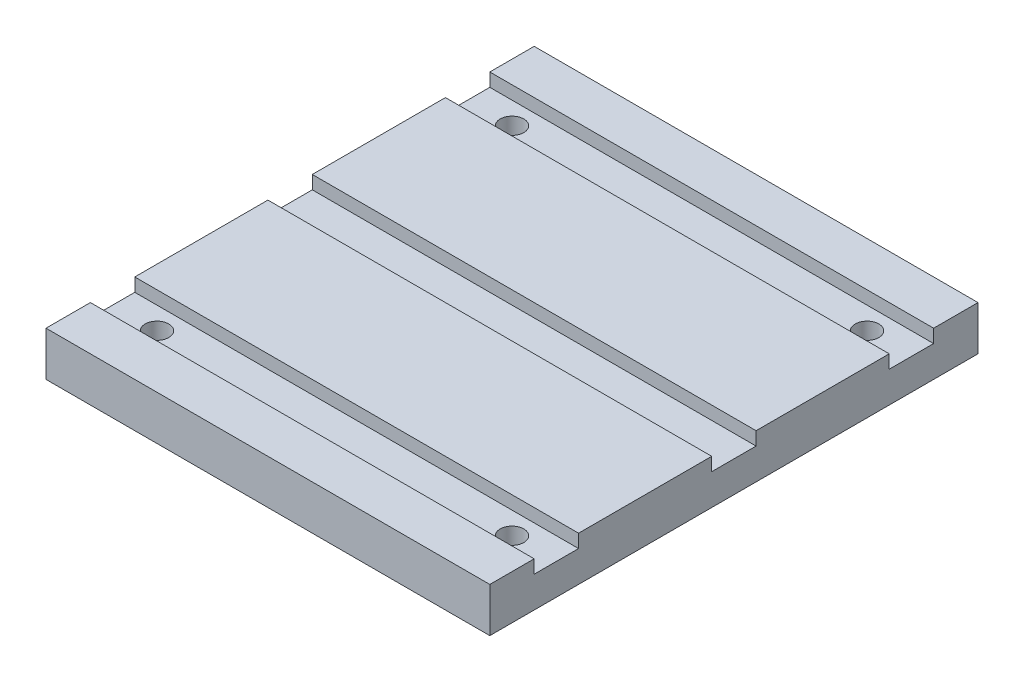
ISO-10303-21;
HEADER;
FILE_DESCRIPTION(('STEP AP214'),'2;1');
FILE_NAME('part.step','',(''),(''),'','','');
FILE_SCHEMA(('AUTOMOTIVE_DESIGN { 1 0 10303 214 1 1 1 1 }'));
ENDSEC;
DATA;
#1=APPLICATION_CONTEXT('core data for automotive mechanical design processes');
#2=APPLICATION_PROTOCOL_DEFINITION('international standard','automotive_design',2000,#1);
#3=PRODUCT_CONTEXT('',#1,'mechanical');
#4=PRODUCT('Part','Part','',(#3));
#5=PRODUCT_RELATED_PRODUCT_CATEGORY('part','',(#4));
#6=PRODUCT_DEFINITION_FORMATION('','',#4);
#7=PRODUCT_DEFINITION_CONTEXT('part definition',#1,'design');
#8=PRODUCT_DEFINITION('design','',#6,#7);
#9=PRODUCT_DEFINITION_SHAPE('','',#8);
#10=(LENGTH_UNIT() NAMED_UNIT(*) SI_UNIT(.MILLI.,.METRE.));
#11=(NAMED_UNIT(*) PLANE_ANGLE_UNIT() SI_UNIT($,.RADIAN.));
#12=(NAMED_UNIT(*) SI_UNIT($,.STERADIAN.) SOLID_ANGLE_UNIT());
#13=UNCERTAINTY_MEASURE_WITH_UNIT(LENGTH_MEASURE(1.E-05),#10,'distance_accuracy_value','');
#14=(GEOMETRIC_REPRESENTATION_CONTEXT(3) GLOBAL_UNCERTAINTY_ASSIGNED_CONTEXT((#13)) GLOBAL_UNIT_ASSIGNED_CONTEXT((#10,
#11,#12)) REPRESENTATION_CONTEXT('',''));
#15=CARTESIAN_POINT('',(0.,0.,0.));
#16=DIRECTION('',(0.,0.,1.));
#17=DIRECTION('',(1.,0.,0.));
#18=AXIS2_PLACEMENT_3D('',#15,#16,#17);
#19=CARTESIAN_POINT('',(0.,12.7,0.));
#20=DIRECTION('',(0.,1.,0.));
#21=DIRECTION('',(0.,0.,1.));
#22=AXIS2_PLACEMENT_3D('',#19,#20,#21);
#23=PLANE('',#22);
#24=DIRECTION('',(1.,0.,0.));
#25=VECTOR('',#24,1.);
#26=CARTESIAN_POINT('',(-12.7,12.7,6.35));
#27=LINE('',#26,#25);
#28=CARTESIAN_POINT('',(-63.5,12.7,6.34999999999999));
#29=VERTEX_POINT('',#28);
#30=CARTESIAN_POINT('',(63.5,12.7,6.34999999999999));
#31=VERTEX_POINT('',#30);
#32=EDGE_CURVE('E156',#29,#31,#27,.T.);
#33=ORIENTED_EDGE('',*,*,#32,.F.);
#34=DIRECTION('',(0.,0.,1.));
#35=VECTOR('',#34,1.);
#36=CARTESIAN_POINT('',(-63.5,12.7,-69.85));
#37=LINE('',#36,#35);
#38=CARTESIAN_POINT('',(-63.5,12.7,44.45));
#39=VERTEX_POINT('',#38);
#40=EDGE_CURVE('E159',#29,#39,#37,.T.);
#41=ORIENTED_EDGE('',*,*,#40,.T.);
#42=DIRECTION('',(1.,0.,0.));
#43=VECTOR('',#42,1.);
#44=CARTESIAN_POINT('',(-12.7,12.7,44.45));
#45=LINE('',#44,#43);
#46=CARTESIAN_POINT('',(63.5,12.7,44.45));
#47=VERTEX_POINT('',#46);
#48=EDGE_CURVE('E225',#39,#47,#45,.T.);
#49=ORIENTED_EDGE('',*,*,#48,.T.);
#50=DIRECTION('',(0.,0.,-1.));
#51=VECTOR('',#50,1.);
#52=CARTESIAN_POINT('',(63.5,12.7,-69.85));
#53=LINE('',#52,#51);
#54=EDGE_CURVE('E162',#47,#31,#53,.T.);
#55=ORIENTED_EDGE('',*,*,#54,.T.);
#56=EDGE_LOOP('',(#33,#41,#49,#55));
#57=FACE_BOUND('',#56,.T.);
#58=ADVANCED_FACE('F33',(#57),#23,.T.);
#59=CARTESIAN_POINT('',(-63.5,12.7,-44.45));
#60=VERTEX_POINT('',#59);
#61=CARTESIAN_POINT('',(-63.5,12.7,-6.35));
#62=VERTEX_POINT('',#61);
#63=EDGE_CURVE('E183',#60,#62,#37,.T.);
#64=ORIENTED_EDGE('',*,*,#63,.T.);
#65=DIRECTION('',(1.,0.,0.));
#66=VECTOR('',#65,1.);
#67=CARTESIAN_POINT('',(-12.7,12.7,-6.34999999999999));
#68=LINE('',#67,#66);
#69=CARTESIAN_POINT('',(63.5,12.7,-6.35));
#70=VERTEX_POINT('',#69);
#71=EDGE_CURVE('E167',#62,#70,#68,.T.);
#72=ORIENTED_EDGE('',*,*,#71,.T.);
#73=CARTESIAN_POINT('',(63.5,12.7,-44.45));
#74=VERTEX_POINT('',#73);
#75=EDGE_CURVE('E280',#70,#74,#53,.T.);
#76=ORIENTED_EDGE('',*,*,#75,.T.);
#77=DIRECTION('',(1.,0.,0.));
#78=VECTOR('',#77,1.);
#79=CARTESIAN_POINT('',(-12.7,12.7,-44.45));
#80=LINE('',#79,#78);
#81=EDGE_CURVE('E266',#60,#74,#80,.T.);
#82=ORIENTED_EDGE('',*,*,#81,.F.);
#83=EDGE_LOOP('',(#64,#72,#76,#82));
#84=FACE_BOUND('',#83,.T.);
#85=ADVANCED_FACE('F291',(#84),#23,.T.);
#86=CARTESIAN_POINT('',(-63.5,12.7,-69.85));
#87=DIRECTION('',(1.,0.,0.));
#88=DIRECTION('',(0.,0.,-1.));
#89=AXIS2_PLACEMENT_3D('',#86,#87,#88);
#90=PLANE('',#89);
#91=DIRECTION('',(0.,-1.,0.));
#92=VECTOR('',#91,1.);
#93=CARTESIAN_POINT('',(-63.5,12.7,6.34999999999999));
#94=LINE('',#93,#92);
#95=CARTESIAN_POINT('',(-63.5,8.89,6.35));
#96=VERTEX_POINT('',#95);
#97=EDGE_CURVE('E170',#29,#96,#94,.T.);
#98=ORIENTED_EDGE('',*,*,#97,.T.);
#99=DIRECTION('',(0.,0.,-1.));
#100=VECTOR('',#99,1.);
#101=CARTESIAN_POINT('',(-63.5,8.89,6.35));
#102=LINE('',#101,#100);
#103=CARTESIAN_POINT('',(-63.5,8.89,-6.35));
#104=VERTEX_POINT('',#103);
#105=EDGE_CURVE('E340',#96,#104,#102,.T.);
#106=ORIENTED_EDGE('',*,*,#105,.T.);
#107=DIRECTION('',(0.,1.,0.));
#108=VECTOR('',#107,1.);
#109=CARTESIAN_POINT('',(-63.5,12.7,-6.35));
#110=LINE('',#109,#108);
#111=EDGE_CURVE('E175',#104,#62,#110,.T.);
#112=ORIENTED_EDGE('',*,*,#111,.T.);
#113=ORIENTED_EDGE('',*,*,#63,.F.);
#114=DIRECTION('',(0.,1.,0.));
#115=VECTOR('',#114,1.);
#116=CARTESIAN_POINT('',(-63.5,12.7,-44.45));
#117=LINE('',#116,#115);
#118=CARTESIAN_POINT('',(-63.5,8.89,-44.45));
#119=VERTEX_POINT('',#118);
#120=EDGE_CURVE('E230',#119,#60,#117,.T.);
#121=ORIENTED_EDGE('',*,*,#120,.F.);
#122=DIRECTION('',(0.,0.,1.));
#123=VECTOR('',#122,1.);
#124=CARTESIAN_POINT('',(-63.5,8.89,-57.15));
#125=LINE('',#124,#123);
#126=CARTESIAN_POINT('',(-63.5,8.89,-57.15));
#127=VERTEX_POINT('',#126);
#128=EDGE_CURVE('E235',#127,#119,#125,.T.);
#129=ORIENTED_EDGE('',*,*,#128,.F.);
#130=DIRECTION('',(0.,-1.,0.));
#131=VECTOR('',#130,1.);
#132=CARTESIAN_POINT('',(-63.5,12.7,-57.15));
#133=LINE('',#132,#131);
#134=CARTESIAN_POINT('',(-63.5,12.7,-57.15));
#135=VERTEX_POINT('',#134);
#136=EDGE_CURVE('E342',#135,#127,#133,.T.);
#137=ORIENTED_EDGE('',*,*,#136,.F.);
#138=CARTESIAN_POINT('',(-63.5,12.7,-69.85));
#139=VERTEX_POINT('',#138);
#140=EDGE_CURVE('E186',#139,#135,#37,.T.);
#141=ORIENTED_EDGE('',*,*,#140,.F.);
#142=DIRECTION('',(0.,-1.,0.));
#143=VECTOR('',#142,1.);
#144=CARTESIAN_POINT('',(-63.5,12.7,-69.85));
#145=LINE('',#144,#143);
#146=CARTESIAN_POINT('',(-63.5,0.,-69.85));
#147=VERTEX_POINT('',#146);
#148=EDGE_CURVE('E42',#139,#147,#145,.T.);
#149=ORIENTED_EDGE('',*,*,#148,.T.);
#150=DIRECTION('',(0.,0.,1.));
#151=VECTOR('',#150,1.);
#152=CARTESIAN_POINT('',(-63.5,0.,-69.85));
#153=LINE('',#152,#151);
#154=CARTESIAN_POINT('',(-63.5,0.,69.85));
#155=VERTEX_POINT('',#154);
#156=EDGE_CURVE('E68',#147,#155,#153,.T.);
#157=ORIENTED_EDGE('',*,*,#156,.T.);
#158=DIRECTION('',(0.,-1.,0.));
#159=VECTOR('',#158,1.);
#160=CARTESIAN_POINT('',(-63.5,12.7,69.85));
#161=LINE('',#160,#159);
#162=CARTESIAN_POINT('',(-63.5,12.7,69.85));
#163=VERTEX_POINT('',#162);
#164=EDGE_CURVE('E194',#163,#155,#161,.T.);
#165=ORIENTED_EDGE('',*,*,#164,.F.);
#166=CARTESIAN_POINT('',(-63.5,12.7,57.15));
#167=VERTEX_POINT('',#166);
#168=EDGE_CURVE('E184',#167,#163,#37,.T.);
#169=ORIENTED_EDGE('',*,*,#168,.F.);
#170=DIRECTION('',(0.,-1.,0.));
#171=VECTOR('',#170,1.);
#172=CARTESIAN_POINT('',(-63.5,12.7,57.15));
#173=LINE('',#172,#171);
#174=CARTESIAN_POINT('',(-63.5,8.89,57.15));
#175=VERTEX_POINT('',#174);
#176=EDGE_CURVE('E221',#167,#175,#173,.T.);
#177=ORIENTED_EDGE('',*,*,#176,.T.);
#178=DIRECTION('',(0.,0.,-1.));
#179=VECTOR('',#178,1.);
#180=CARTESIAN_POINT('',(-63.5,8.89,57.15));
#181=LINE('',#180,#179);
#182=CARTESIAN_POINT('',(-63.5,8.89,44.45));
#183=VERTEX_POINT('',#182);
#184=EDGE_CURVE('E232',#175,#183,#181,.T.);
#185=ORIENTED_EDGE('',*,*,#184,.T.);
#186=DIRECTION('',(0.,1.,0.));
#187=VECTOR('',#186,1.);
#188=CARTESIAN_POINT('',(-63.5,12.7,44.45));
#189=LINE('',#188,#187);
#190=EDGE_CURVE('E182',#183,#39,#189,.T.);
#191=ORIENTED_EDGE('',*,*,#190,.T.);
#192=ORIENTED_EDGE('',*,*,#40,.F.);
#193=EDGE_LOOP('',(#98,#106,#112,#113,#121,#129,#137,#141,#149,#157,#165,#169,#177,#185,#191,#192));
#194=FACE_BOUND('',#193,.T.);
#195=ADVANCED_FACE('F179',(#194),#90,.F.);
#196=ORIENTED_EDGE('',*,*,#140,.T.);
#197=DIRECTION('',(1.,0.,0.));
#198=VECTOR('',#197,1.);
#199=CARTESIAN_POINT('',(-12.7,12.7,-57.15));
#200=LINE('',#199,#198);
#201=CARTESIAN_POINT('',(63.5,12.7,-57.15));
#202=VERTEX_POINT('',#201);
#203=EDGE_CURVE('E260',#135,#202,#200,.T.);
#204=ORIENTED_EDGE('',*,*,#203,.T.);
#205=CARTESIAN_POINT('',(63.5,12.7,-69.85));
#206=VERTEX_POINT('',#205);
#207=EDGE_CURVE('E82',#202,#206,#53,.T.);
#208=ORIENTED_EDGE('',*,*,#207,.T.);
#209=DIRECTION('',(-1.,0.,0.));
#210=VECTOR('',#209,1.);
#211=CARTESIAN_POINT('',(-63.5,12.7,-69.85));
#212=LINE('',#211,#210);
#213=EDGE_CURVE('E188',#206,#139,#212,.T.);
#214=ORIENTED_EDGE('',*,*,#213,.T.);
#215=EDGE_LOOP('',(#196,#204,#208,#214));
#216=FACE_BOUND('',#215,.T.);
#217=ADVANCED_FACE('F281',(#216),#23,.T.);
#218=DIRECTION('',(1.,0.,0.));
#219=VECTOR('',#218,1.);
#220=CARTESIAN_POINT('',(-12.7,12.7,57.15));
#221=LINE('',#220,#219);
#222=CARTESIAN_POINT('',(63.5,12.7,57.15));
#223=VERTEX_POINT('',#222);
#224=EDGE_CURVE('E201',#167,#223,#221,.T.);
#225=ORIENTED_EDGE('',*,*,#224,.F.);
#226=ORIENTED_EDGE('',*,*,#168,.T.);
#227=DIRECTION('',(1.,0.,0.));
#228=VECTOR('',#227,1.);
#229=CARTESIAN_POINT('',(-63.5,12.7,69.85));
#230=LINE('',#229,#228);
#231=CARTESIAN_POINT('',(63.5,12.7,69.85));
#232=VERTEX_POINT('',#231);
#233=EDGE_CURVE('E50',#163,#232,#230,.T.);
#234=ORIENTED_EDGE('',*,*,#233,.T.);
#235=EDGE_CURVE('E216',#232,#223,#53,.T.);
#236=ORIENTED_EDGE('',*,*,#235,.T.);
#237=EDGE_LOOP('',(#225,#226,#234,#236));
#238=FACE_BOUND('',#237,.T.);
#239=ADVANCED_FACE('F222',(#238),#23,.T.);
#240=CARTESIAN_POINT('',(63.5,12.7,-69.85));
#241=DIRECTION('',(-1.,0.,0.));
#242=DIRECTION('',(0.,0.,1.));
#243=AXIS2_PLACEMENT_3D('',#240,#241,#242);
#244=PLANE('',#243);
#245=DIRECTION('',(0.,0.,-1.));
#246=VECTOR('',#245,1.);
#247=CARTESIAN_POINT('',(63.5,8.89,6.35));
#248=LINE('',#247,#246);
#249=CARTESIAN_POINT('',(63.5,8.89,6.35));
#250=VERTEX_POINT('',#249);
#251=CARTESIAN_POINT('',(63.5,8.89,-6.35));
#252=VERTEX_POINT('',#251);
#253=EDGE_CURVE('E242',#250,#252,#248,.T.);
#254=ORIENTED_EDGE('',*,*,#253,.F.);
#255=DIRECTION('',(0.,-1.,0.));
#256=VECTOR('',#255,1.);
#257=CARTESIAN_POINT('',(63.5,12.7,6.34999999999999));
#258=LINE('',#257,#256);
#259=EDGE_CURVE('E240',#31,#250,#258,.T.);
#260=ORIENTED_EDGE('',*,*,#259,.F.);
#261=ORIENTED_EDGE('',*,*,#54,.F.);
#262=DIRECTION('',(0.,1.,0.));
#263=VECTOR('',#262,1.);
#264=CARTESIAN_POINT('',(63.5,12.7,44.45));
#265=LINE('',#264,#263);
#266=CARTESIAN_POINT('',(63.5,8.89,44.45));
#267=VERTEX_POINT('',#266);
#268=EDGE_CURVE('E273',#267,#47,#265,.T.);
#269=ORIENTED_EDGE('',*,*,#268,.F.);
#270=DIRECTION('',(0.,0.,-1.));
#271=VECTOR('',#270,1.);
#272=CARTESIAN_POINT('',(63.5,8.89,57.15));
#273=LINE('',#272,#271);
#274=CARTESIAN_POINT('',(63.5,8.89,57.15));
#275=VERTEX_POINT('',#274);
#276=EDGE_CURVE('E270',#275,#267,#273,.T.);
#277=ORIENTED_EDGE('',*,*,#276,.F.);
#278=DIRECTION('',(0.,-1.,0.));
#279=VECTOR('',#278,1.);
#280=CARTESIAN_POINT('',(63.5,12.7,57.15));
#281=LINE('',#280,#279);
#282=EDGE_CURVE('E263',#223,#275,#281,.T.);
#283=ORIENTED_EDGE('',*,*,#282,.F.);
#284=ORIENTED_EDGE('',*,*,#235,.F.);
#285=DIRECTION('',(0.,-1.,0.));
#286=VECTOR('',#285,1.);
#287=CARTESIAN_POINT('',(63.5,12.7,69.85));
#288=LINE('',#287,#286);
#289=CARTESIAN_POINT('',(63.5,0.,69.85));
#290=VERTEX_POINT('',#289);
#291=EDGE_CURVE('E193',#232,#290,#288,.T.);
#292=ORIENTED_EDGE('',*,*,#291,.T.);
#293=DIRECTION('',(0.,0.,-1.));
#294=VECTOR('',#293,1.);
#295=CARTESIAN_POINT('',(63.5,0.,-69.85));
#296=LINE('',#295,#294);
#297=CARTESIAN_POINT('',(63.5,0.,-69.85));
#298=VERTEX_POINT('',#297);
#299=EDGE_CURVE('E197',#290,#298,#296,.T.);
#300=ORIENTED_EDGE('',*,*,#299,.T.);
#301=DIRECTION('',(0.,-1.,0.));
#302=VECTOR('',#301,1.);
#303=CARTESIAN_POINT('',(63.5,12.7,-69.85));
#304=LINE('',#303,#302);
#305=EDGE_CURVE('E11',#206,#298,#304,.T.);
#306=ORIENTED_EDGE('',*,*,#305,.F.);
#307=ORIENTED_EDGE('',*,*,#207,.F.);
#308=DIRECTION('',(0.,-1.,0.));
#309=VECTOR('',#308,1.);
#310=CARTESIAN_POINT('',(63.5,12.7,-57.15));
#311=LINE('',#310,#309);
#312=CARTESIAN_POINT('',(63.5,8.89,-57.15));
#313=VERTEX_POINT('',#312);
#314=EDGE_CURVE('E166',#202,#313,#311,.T.);
#315=ORIENTED_EDGE('',*,*,#314,.T.);
#316=DIRECTION('',(0.,0.,1.));
#317=VECTOR('',#316,1.);
#318=CARTESIAN_POINT('',(63.5,8.89,-57.15));
#319=LINE('',#318,#317);
#320=CARTESIAN_POINT('',(63.5,8.89,-44.45));
#321=VERTEX_POINT('',#320);
#322=EDGE_CURVE('E257',#313,#321,#319,.T.);
#323=ORIENTED_EDGE('',*,*,#322,.T.);
#324=DIRECTION('',(0.,1.,0.));
#325=VECTOR('',#324,1.);
#326=CARTESIAN_POINT('',(63.5,12.7,-44.45));
#327=LINE('',#326,#325);
#328=EDGE_CURVE('E254',#321,#74,#327,.T.);
#329=ORIENTED_EDGE('',*,*,#328,.T.);
#330=ORIENTED_EDGE('',*,*,#75,.F.);
#331=DIRECTION('',(0.,1.,0.));
#332=VECTOR('',#331,1.);
#333=CARTESIAN_POINT('',(63.5,12.7,-6.35));
#334=LINE('',#333,#332);
#335=EDGE_CURVE('E245',#252,#70,#334,.T.);
#336=ORIENTED_EDGE('',*,*,#335,.F.);
#337=EDGE_LOOP('',(#254,#260,#261,#269,#277,#283,#284,#292,#300,#306,#307,#315,#323,#329,#330,#336));
#338=FACE_BOUND('',#337,.T.);
#339=ADVANCED_FACE('F35',(#338),#244,.F.);
#340=CARTESIAN_POINT('',(-63.5,12.7,-69.85));
#341=DIRECTION('',(0.,0.,1.));
#342=DIRECTION('',(1.,0.,0.));
#343=AXIS2_PLACEMENT_3D('',#340,#341,#342);
#344=PLANE('',#343);
#345=DIRECTION('',(-1.,0.,0.));
#346=VECTOR('',#345,1.);
#347=CARTESIAN_POINT('',(-63.5,0.,-69.85));
#348=LINE('',#347,#346);
#349=EDGE_CURVE('E200',#298,#147,#348,.T.);
#350=ORIENTED_EDGE('',*,*,#349,.T.);
#351=ORIENTED_EDGE('',*,*,#148,.F.);
#352=ORIENTED_EDGE('',*,*,#213,.F.);
#353=ORIENTED_EDGE('',*,*,#305,.T.);
#354=EDGE_LOOP('',(#350,#351,#352,#353));
#355=FACE_BOUND('',#354,.T.);
#356=ADVANCED_FACE('F282',(#355),#344,.F.);
#357=CARTESIAN_POINT('',(-63.5,12.7,69.85));
#358=DIRECTION('',(0.,0.,-1.));
#359=DIRECTION('',(-1.,0.,0.));
#360=AXIS2_PLACEMENT_3D('',#357,#358,#359);
#361=PLANE('',#360);
#362=DIRECTION('',(1.,0.,0.));
#363=VECTOR('',#362,1.);
#364=CARTESIAN_POINT('',(-63.5,0.,69.85));
#365=LINE('',#364,#363);
#366=EDGE_CURVE('E74',#155,#290,#365,.T.);
#367=ORIENTED_EDGE('',*,*,#366,.T.);
#368=ORIENTED_EDGE('',*,*,#291,.F.);
#369=ORIENTED_EDGE('',*,*,#233,.F.);
#370=ORIENTED_EDGE('',*,*,#164,.T.);
#371=EDGE_LOOP('',(#367,#368,#369,#370));
#372=FACE_BOUND('',#371,.T.);
#373=ADVANCED_FACE('F217',(#372),#361,.F.);
#374=CARTESIAN_POINT('',(0.,0.,0.));
#375=DIRECTION('',(0.,1.,0.));
#376=DIRECTION('',(0.,0.,1.));
#377=AXIS2_PLACEMENT_3D('',#374,#375,#376);
#378=PLANE('',#377);
#379=CARTESIAN_POINT('',(50.8,0.,50.8));
#380=DIRECTION('',(0.,-1.,0.));
#381=DIRECTION('',(0.,0.,-1.));
#382=AXIS2_PLACEMENT_3D('',#379,#380,#381);
#383=CIRCLE('',#382,3.37819999999998);
#384=CARTESIAN_POINT('',(50.8,0.,47.4218));
#385=VERTEX_POINT('',#384);
#386=EDGE_CURVE('E317',#385,#385,#383,.T.);
#387=ORIENTED_EDGE('',*,*,#386,.F.);
#388=EDGE_LOOP('',(#387));
#389=FACE_BOUND('',#388,.T.);
#390=CARTESIAN_POINT('',(50.8,0.,-50.8));
#391=DIRECTION('',(0.,-1.,0.));
#392=DIRECTION('',(0.,0.,-1.));
#393=AXIS2_PLACEMENT_3D('',#390,#391,#392);
#394=CIRCLE('',#393,3.37819999999998);
#395=CARTESIAN_POINT('',(50.8,0.,-54.1782));
#396=VERTEX_POINT('',#395);
#397=EDGE_CURVE('E321',#396,#396,#394,.T.);
#398=ORIENTED_EDGE('',*,*,#397,.F.);
#399=EDGE_LOOP('',(#398));
#400=FACE_BOUND('',#399,.T.);
#401=CARTESIAN_POINT('',(-50.8,0.,-50.8));
#402=DIRECTION('',(0.,-1.,0.));
#403=DIRECTION('',(0.,0.,-1.));
#404=AXIS2_PLACEMENT_3D('',#401,#402,#403);
#405=CIRCLE('',#404,3.37819999999998);
#406=CARTESIAN_POINT('',(-50.8,0.,-54.1782));
#407=VERTEX_POINT('',#406);
#408=EDGE_CURVE('E325',#407,#407,#405,.T.);
#409=ORIENTED_EDGE('',*,*,#408,.F.);
#410=EDGE_LOOP('',(#409));
#411=FACE_BOUND('',#410,.T.);
#412=CARTESIAN_POINT('',(-50.8,0.,50.8));
#413=DIRECTION('',(0.,-1.,0.));
#414=DIRECTION('',(0.,0.,-1.));
#415=AXIS2_PLACEMENT_3D('',#412,#413,#414);
#416=CIRCLE('',#415,3.37819999999998);
#417=CARTESIAN_POINT('',(-50.8,0.,47.4218));
#418=VERTEX_POINT('',#417);
#419=EDGE_CURVE('E328',#418,#418,#416,.T.);
#420=ORIENTED_EDGE('',*,*,#419,.F.);
#421=EDGE_LOOP('',(#420));
#422=FACE_BOUND('',#421,.T.);
#423=ORIENTED_EDGE('',*,*,#299,.F.);
#424=ORIENTED_EDGE('',*,*,#366,.F.);
#425=ORIENTED_EDGE('',*,*,#156,.F.);
#426=ORIENTED_EDGE('',*,*,#349,.F.);
#427=EDGE_LOOP('',(#423,#424,#425,#426));
#428=FACE_BOUND('',#427,.T.);
#429=ADVANCED_FACE('F210',(#389,#400,#411,#422,#428),#378,.F.);
#430=CARTESIAN_POINT('',(-12.7,12.7,57.15));
#431=DIRECTION('',(0.,0.,1.));
#432=DIRECTION('',(1.,0.,0.));
#433=AXIS2_PLACEMENT_3D('',#430,#431,#432);
#434=PLANE('',#433);
#435=ORIENTED_EDGE('',*,*,#224,.T.);
#436=ORIENTED_EDGE('',*,*,#282,.T.);
#437=DIRECTION('',(1.,0.,0.));
#438=VECTOR('',#437,1.);
#439=CARTESIAN_POINT('',(-12.7,8.89,57.15));
#440=LINE('',#439,#438);
#441=EDGE_CURVE('E228',#175,#275,#440,.T.);
#442=ORIENTED_EDGE('',*,*,#441,.F.);
#443=ORIENTED_EDGE('',*,*,#176,.F.);
#444=EDGE_LOOP('',(#435,#436,#442,#443));
#445=FACE_BOUND('',#444,.T.);
#446=ADVANCED_FACE('F227',(#445),#434,.F.);
#447=CARTESIAN_POINT('',(-12.7,12.7,44.45));
#448=DIRECTION('',(0.,0.,-1.));
#449=DIRECTION('',(-1.,0.,0.));
#450=AXIS2_PLACEMENT_3D('',#447,#448,#449);
#451=PLANE('',#450);
#452=DIRECTION('',(1.,0.,0.));
#453=VECTOR('',#452,1.);
#454=CARTESIAN_POINT('',(-12.7,8.89,44.45));
#455=LINE('',#454,#453);
#456=EDGE_CURVE('E277',#183,#267,#455,.T.);
#457=ORIENTED_EDGE('',*,*,#456,.T.);
#458=ORIENTED_EDGE('',*,*,#268,.T.);
#459=ORIENTED_EDGE('',*,*,#48,.F.);
#460=ORIENTED_EDGE('',*,*,#190,.F.);
#461=EDGE_LOOP('',(#457,#458,#459,#460));
#462=FACE_BOUND('',#461,.T.);
#463=ADVANCED_FACE('F313',(#462),#451,.F.);
#464=CARTESIAN_POINT('',(-12.7,8.89,57.15));
#465=DIRECTION('',(0.,-1.,0.));
#466=DIRECTION('',(0.,0.,-1.));
#467=AXIS2_PLACEMENT_3D('',#464,#465,#466);
#468=PLANE('',#467);
#469=CARTESIAN_POINT('',(50.8,8.89,50.8));
#470=DIRECTION('',(0.,-1.,0.));
#471=DIRECTION('',(0.,0.,-1.));
#472=AXIS2_PLACEMENT_3D('',#469,#470,#471);
#473=CIRCLE('',#472,3.37819999999999);
#474=CARTESIAN_POINT('',(50.8,8.89,47.4218));
#475=VERTEX_POINT('',#474);
#476=EDGE_CURVE('E454',#475,#475,#473,.T.);
#477=ORIENTED_EDGE('',*,*,#476,.T.);
#478=EDGE_LOOP('',(#477));
#479=FACE_BOUND('',#478,.T.);
#480=CARTESIAN_POINT('',(-50.8,8.89,50.8));
#481=DIRECTION('',(0.,-1.,0.));
#482=DIRECTION('',(0.,0.,-1.));
#483=AXIS2_PLACEMENT_3D('',#480,#481,#482);
#484=CIRCLE('',#483,3.37819999999999);
#485=CARTESIAN_POINT('',(-50.8,8.89,47.4218));
#486=VERTEX_POINT('',#485);
#487=EDGE_CURVE('E176',#486,#486,#484,.T.);
#488=ORIENTED_EDGE('',*,*,#487,.T.);
#489=EDGE_LOOP('',(#488));
#490=FACE_BOUND('',#489,.T.);
#491=ORIENTED_EDGE('',*,*,#441,.T.);
#492=ORIENTED_EDGE('',*,*,#276,.T.);
#493=ORIENTED_EDGE('',*,*,#456,.F.);
#494=ORIENTED_EDGE('',*,*,#184,.F.);
#495=EDGE_LOOP('',(#491,#492,#493,#494));
#496=FACE_BOUND('',#495,.T.);
#497=ADVANCED_FACE('F360',(#479,#490,#496),#468,.F.);
#498=CARTESIAN_POINT('',(-12.7,12.7,-57.15));
#499=DIRECTION('',(0.,0.,1.));
#500=DIRECTION('',(1.,0.,0.));
#501=AXIS2_PLACEMENT_3D('',#498,#499,#500);
#502=PLANE('',#501);
#503=DIRECTION('',(1.,0.,0.));
#504=VECTOR('',#503,1.);
#505=CARTESIAN_POINT('',(-12.7,8.89,-57.15));
#506=LINE('',#505,#504);
#507=EDGE_CURVE('E261',#127,#313,#506,.T.);
#508=ORIENTED_EDGE('',*,*,#507,.T.);
#509=ORIENTED_EDGE('',*,*,#314,.F.);
#510=ORIENTED_EDGE('',*,*,#203,.F.);
#511=ORIENTED_EDGE('',*,*,#136,.T.);
#512=EDGE_LOOP('',(#508,#509,#510,#511));
#513=FACE_BOUND('',#512,.T.);
#514=ADVANCED_FACE('F358',(#513),#502,.T.);
#515=CARTESIAN_POINT('',(-12.7,8.89,-57.15));
#516=DIRECTION('',(0.,1.,0.));
#517=DIRECTION('',(0.,0.,1.));
#518=AXIS2_PLACEMENT_3D('',#515,#516,#517);
#519=PLANE('',#518);
#520=CARTESIAN_POINT('',(50.8,8.89,-50.8));
#521=DIRECTION('',(0.,1.,0.));
#522=DIRECTION('',(0.,0.,1.));
#523=AXIS2_PLACEMENT_3D('',#520,#521,#522);
#524=CIRCLE('',#523,3.37819999999999);
#525=CARTESIAN_POINT('',(50.8,8.89,-47.4218));
#526=VERTEX_POINT('',#525);
#527=EDGE_CURVE('E456',#526,#526,#524,.T.);
#528=ORIENTED_EDGE('',*,*,#527,.F.);
#529=EDGE_LOOP('',(#528));
#530=FACE_BOUND('',#529,.T.);
#531=CARTESIAN_POINT('',(-50.8,8.89,-50.8));
#532=DIRECTION('',(0.,1.,0.));
#533=DIRECTION('',(0.,0.,1.));
#534=AXIS2_PLACEMENT_3D('',#531,#532,#533);
#535=CIRCLE('',#534,3.37819999999999);
#536=CARTESIAN_POINT('',(-50.8,8.89,-47.4218));
#537=VERTEX_POINT('',#536);
#538=EDGE_CURVE('E330',#537,#537,#535,.T.);
#539=ORIENTED_EDGE('',*,*,#538,.F.);
#540=EDGE_LOOP('',(#539));
#541=FACE_BOUND('',#540,.T.);
#542=DIRECTION('',(1.,0.,0.));
#543=VECTOR('',#542,1.);
#544=CARTESIAN_POINT('',(-12.7,8.89,-44.45));
#545=LINE('',#544,#543);
#546=EDGE_CURVE('E264',#119,#321,#545,.T.);
#547=ORIENTED_EDGE('',*,*,#546,.T.);
#548=ORIENTED_EDGE('',*,*,#322,.F.);
#549=ORIENTED_EDGE('',*,*,#507,.F.);
#550=ORIENTED_EDGE('',*,*,#128,.T.);
#551=EDGE_LOOP('',(#547,#548,#549,#550));
#552=FACE_BOUND('',#551,.T.);
#553=ADVANCED_FACE('F348',(#530,#541,#552),#519,.T.);
#554=CARTESIAN_POINT('',(-12.7,12.7,-44.45));
#555=DIRECTION('',(0.,0.,-1.));
#556=DIRECTION('',(-1.,0.,0.));
#557=AXIS2_PLACEMENT_3D('',#554,#555,#556);
#558=PLANE('',#557);
#559=ORIENTED_EDGE('',*,*,#81,.T.);
#560=ORIENTED_EDGE('',*,*,#328,.F.);
#561=ORIENTED_EDGE('',*,*,#546,.F.);
#562=ORIENTED_EDGE('',*,*,#120,.T.);
#563=EDGE_LOOP('',(#559,#560,#561,#562));
#564=FACE_BOUND('',#563,.T.);
#565=ADVANCED_FACE('F353',(#564),#558,.T.);
#566=CARTESIAN_POINT('',(-12.7,12.7,6.35));
#567=DIRECTION('',(0.,0.,1.));
#568=DIRECTION('',(0.,-1.,0.));
#569=AXIS2_PLACEMENT_3D('',#566,#567,#568);
#570=PLANE('',#569);
#571=ORIENTED_EDGE('',*,*,#32,.T.);
#572=ORIENTED_EDGE('',*,*,#259,.T.);
#573=DIRECTION('',(1.,0.,0.));
#574=VECTOR('',#573,1.);
#575=CARTESIAN_POINT('',(-12.7,8.89,6.35));
#576=LINE('',#575,#574);
#577=EDGE_CURVE('E172',#96,#250,#576,.T.);
#578=ORIENTED_EDGE('',*,*,#577,.F.);
#579=ORIENTED_EDGE('',*,*,#97,.F.);
#580=EDGE_LOOP('',(#571,#572,#578,#579));
#581=FACE_BOUND('',#580,.T.);
#582=ADVANCED_FACE('F171',(#581),#570,.F.);
#583=CARTESIAN_POINT('',(-12.7,12.7,-6.34999999999999));
#584=DIRECTION('',(0.,0.,-1.));
#585=DIRECTION('',(-1.,0.,0.));
#586=AXIS2_PLACEMENT_3D('',#583,#584,#585);
#587=PLANE('',#586);
#588=DIRECTION('',(1.,0.,0.));
#589=VECTOR('',#588,1.);
#590=CARTESIAN_POINT('',(-12.7,8.89,-6.34999999999999));
#591=LINE('',#590,#589);
#592=EDGE_CURVE('E249',#104,#252,#591,.T.);
#593=ORIENTED_EDGE('',*,*,#592,.T.);
#594=ORIENTED_EDGE('',*,*,#335,.T.);
#595=ORIENTED_EDGE('',*,*,#71,.F.);
#596=ORIENTED_EDGE('',*,*,#111,.F.);
#597=EDGE_LOOP('',(#593,#594,#595,#596));
#598=FACE_BOUND('',#597,.T.);
#599=ADVANCED_FACE('F381',(#598),#587,.F.);
#600=CARTESIAN_POINT('',(-12.7,8.89,6.35));
#601=DIRECTION('',(0.,-1.,0.));
#602=DIRECTION('',(0.,0.,-1.));
#603=AXIS2_PLACEMENT_3D('',#600,#601,#602);
#604=PLANE('',#603);
#605=ORIENTED_EDGE('',*,*,#577,.T.);
#606=ORIENTED_EDGE('',*,*,#253,.T.);
#607=ORIENTED_EDGE('',*,*,#592,.F.);
#608=ORIENTED_EDGE('',*,*,#105,.F.);
#609=EDGE_LOOP('',(#605,#606,#607,#608));
#610=FACE_BOUND('',#609,.T.);
#611=ADVANCED_FACE('F384',(#610),#604,.F.);
#612=CARTESIAN_POINT('',(-50.8,0.,50.8));
#613=DIRECTION('',(0.,-1.,0.));
#614=DIRECTION('',(0.,0.,-1.));
#615=AXIS2_PLACEMENT_3D('',#612,#613,#614);
#616=CYLINDRICAL_SURFACE('',#615,3.37819999999999);
#617=ORIENTED_EDGE('',*,*,#419,.T.);
#618=EDGE_LOOP('',(#617));
#619=FACE_BOUND('',#618,.T.);
#620=ORIENTED_EDGE('',*,*,#487,.F.);
#621=EDGE_LOOP('',(#620));
#622=FACE_BOUND('',#621,.T.);
#623=ADVANCED_FACE('F386',(#619,#622),#616,.F.);
#624=CARTESIAN_POINT('',(-50.8,0.,-50.8));
#625=DIRECTION('',(0.,-1.,0.));
#626=DIRECTION('',(0.,0.,-1.));
#627=AXIS2_PLACEMENT_3D('',#624,#625,#626);
#628=CYLINDRICAL_SURFACE('',#627,3.37819999999999);
#629=ORIENTED_EDGE('',*,*,#538,.T.);
#630=EDGE_LOOP('',(#629));
#631=FACE_BOUND('',#630,.T.);
#632=ORIENTED_EDGE('',*,*,#408,.T.);
#633=EDGE_LOOP('',(#632));
#634=FACE_BOUND('',#633,.T.);
#635=ADVANCED_FACE('F392',(#631,#634),#628,.F.);
#636=CARTESIAN_POINT('',(50.8,0.,-50.8));
#637=DIRECTION('',(0.,-1.,0.));
#638=DIRECTION('',(0.,0.,-1.));
#639=AXIS2_PLACEMENT_3D('',#636,#637,#638);
#640=CYLINDRICAL_SURFACE('',#639,3.37819999999999);
#641=ORIENTED_EDGE('',*,*,#527,.T.);
#642=EDGE_LOOP('',(#641));
#643=FACE_BOUND('',#642,.T.);
#644=ORIENTED_EDGE('',*,*,#397,.T.);
#645=EDGE_LOOP('',(#644));
#646=FACE_BOUND('',#645,.T.);
#647=ADVANCED_FACE('F427',(#643,#646),#640,.F.);
#648=CARTESIAN_POINT('',(50.8,0.,50.8));
#649=DIRECTION('',(0.,-1.,0.));
#650=DIRECTION('',(0.,0.,-1.));
#651=AXIS2_PLACEMENT_3D('',#648,#649,#650);
#652=CYLINDRICAL_SURFACE('',#651,3.37819999999999);
#653=ORIENTED_EDGE('',*,*,#386,.T.);
#654=EDGE_LOOP('',(#653));
#655=FACE_BOUND('',#654,.T.);
#656=ORIENTED_EDGE('',*,*,#476,.F.);
#657=EDGE_LOOP('',(#656));
#658=FACE_BOUND('',#657,.T.);
#659=ADVANCED_FACE('F437',(#655,#658),#652,.F.);
#660=CLOSED_SHELL('',(#58,#85,#195,#217,#239,#339,#356,#373,#429,#446,#463,#497,#514,#553,#565,
#582,#599,#611,#623,#635,#647,#659));
#661=MANIFOLD_SOLID_BREP('B2',#660);
#662=ADVANCED_BREP_SHAPE_REPRESENTATION('',(#18,#661),#14);
#663=SHAPE_DEFINITION_REPRESENTATION(#9,#662);
ENDSEC;
END-ISO-10303-21;
